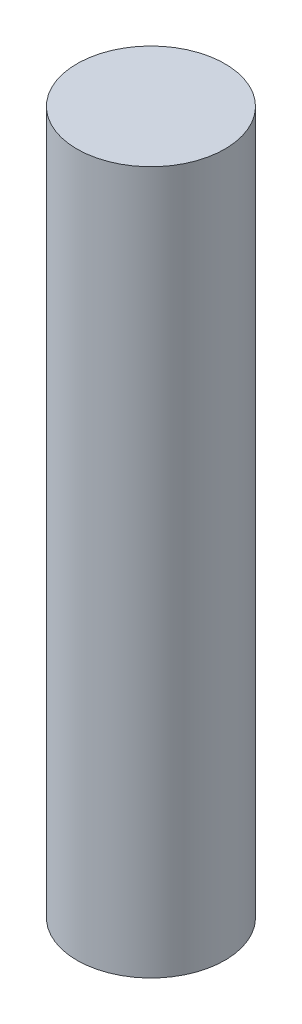
ISO-10303-21;
HEADER;
FILE_DESCRIPTION(('STEP AP214'),'2;1');
FILE_NAME('part.step','',(''),(''),'','','');
FILE_SCHEMA(('AUTOMOTIVE_DESIGN { 1 0 10303 214 1 1 1 1 }'));
ENDSEC;
DATA;
#1=APPLICATION_CONTEXT('core data for automotive mechanical design processes');
#2=APPLICATION_PROTOCOL_DEFINITION('international standard','automotive_design',2000,#1);
#3=PRODUCT_CONTEXT('',#1,'mechanical');
#4=PRODUCT('Part','Part','',(#3));
#5=PRODUCT_RELATED_PRODUCT_CATEGORY('part','',(#4));
#6=PRODUCT_DEFINITION_FORMATION('','',#4);
#7=PRODUCT_DEFINITION_CONTEXT('part definition',#1,'design');
#8=PRODUCT_DEFINITION('design','',#6,#7);
#9=PRODUCT_DEFINITION_SHAPE('','',#8);
#10=(LENGTH_UNIT() NAMED_UNIT(*) SI_UNIT(.MILLI.,.METRE.));
#11=(NAMED_UNIT(*) PLANE_ANGLE_UNIT() SI_UNIT($,.RADIAN.));
#12=(NAMED_UNIT(*) SI_UNIT($,.STERADIAN.) SOLID_ANGLE_UNIT());
#13=UNCERTAINTY_MEASURE_WITH_UNIT(LENGTH_MEASURE(1.E-05),#10,'distance_accuracy_value','');
#14=(GEOMETRIC_REPRESENTATION_CONTEXT(3) GLOBAL_UNCERTAINTY_ASSIGNED_CONTEXT((#13)) GLOBAL_UNIT_ASSIGNED_CONTEXT((#10,
#11,#12)) REPRESENTATION_CONTEXT('',''));
#15=CARTESIAN_POINT('',(0.,0.,0.));
#16=DIRECTION('',(0.,0.,1.));
#17=DIRECTION('',(1.,0.,0.));
#18=AXIS2_PLACEMENT_3D('',#15,#16,#17);
#19=CARTESIAN_POINT('',(0.,38.,0.));
#20=DIRECTION('',(0.,-1.,0.));
#21=DIRECTION('',(0.,0.,-1.));
#22=AXIS2_PLACEMENT_3D('',#19,#20,#21);
#23=CYLINDRICAL_SURFACE('',#22,4.);
#24=CARTESIAN_POINT('',(0.,38.,0.));
#25=DIRECTION('',(0.,1.,0.));
#26=DIRECTION('',(0.,0.,1.));
#27=AXIS2_PLACEMENT_3D('',#24,#25,#26);
#28=CIRCLE('',#27,4.);
#29=CARTESIAN_POINT('',(0.,38.,4.));
#30=VERTEX_POINT('',#29);
#31=EDGE_CURVE('E10',#30,#30,#28,.T.);
#32=ORIENTED_EDGE('',*,*,#31,.F.);
#33=EDGE_LOOP('',(#32));
#34=FACE_BOUND('',#33,.T.);
#35=CARTESIAN_POINT('',(0.,0.,0.));
#36=DIRECTION('',(0.,1.,0.));
#37=DIRECTION('',(0.,0.,1.));
#38=AXIS2_PLACEMENT_3D('',#35,#36,#37);
#39=CIRCLE('',#38,4.);
#40=CARTESIAN_POINT('',(0.,0.,4.));
#41=VERTEX_POINT('',#40);
#42=EDGE_CURVE('E36',#41,#41,#39,.T.);
#43=ORIENTED_EDGE('',*,*,#42,.T.);
#44=EDGE_LOOP('',(#43));
#45=FACE_BOUND('',#44,.T.);
#46=ADVANCED_FACE('F33',(#34,#45),#23,.T.);
#47=CARTESIAN_POINT('',(0.,38.,0.));
#48=DIRECTION('',(0.,1.,0.));
#49=DIRECTION('',(0.,0.,1.));
#50=AXIS2_PLACEMENT_3D('',#47,#48,#49);
#51=PLANE('',#50);
#52=ORIENTED_EDGE('',*,*,#31,.T.);
#53=EDGE_LOOP('',(#52));
#54=FACE_BOUND('',#53,.T.);
#55=ADVANCED_FACE('F48',(#54),#51,.T.);
#56=CARTESIAN_POINT('',(0.,0.,0.));
#57=DIRECTION('',(0.,1.,0.));
#58=DIRECTION('',(0.,0.,1.));
#59=AXIS2_PLACEMENT_3D('',#56,#57,#58);
#60=PLANE('',#59);
#61=ORIENTED_EDGE('',*,*,#42,.F.);
#62=EDGE_LOOP('',(#61));
#63=FACE_BOUND('',#62,.T.);
#64=ADVANCED_FACE('F46',(#63),#60,.F.);
#65=CLOSED_SHELL('',(#46,#55,#64));
#66=MANIFOLD_SOLID_BREP('B2',#65);
#67=ADVANCED_BREP_SHAPE_REPRESENTATION('',(#18,#66),#14);
#68=SHAPE_DEFINITION_REPRESENTATION(#9,#67);
ENDSEC;
END-ISO-10303-21;
